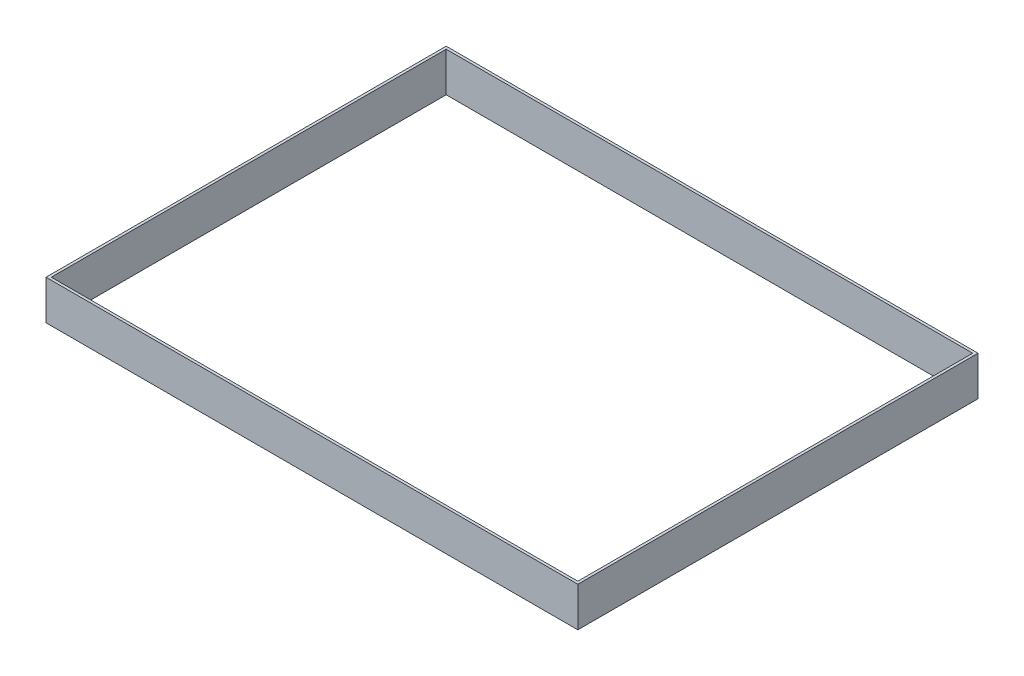
ISO-10303-21;
HEADER;
FILE_DESCRIPTION(('STEP AP214'),'2;1');
FILE_NAME('part.step','',(''),(''),'','','');
FILE_SCHEMA(('AUTOMOTIVE_DESIGN { 1 0 10303 214 1 1 1 1 }'));
ENDSEC;
DATA;
#1=APPLICATION_CONTEXT('core data for automotive mechanical design processes');
#2=APPLICATION_PROTOCOL_DEFINITION('international standard','automotive_design',2000,#1);
#3=PRODUCT_CONTEXT('',#1,'mechanical');
#4=PRODUCT('Part','Part','',(#3));
#5=PRODUCT_RELATED_PRODUCT_CATEGORY('part','',(#4));
#6=PRODUCT_DEFINITION_FORMATION('','',#4);
#7=PRODUCT_DEFINITION_CONTEXT('part definition',#1,'design');
#8=PRODUCT_DEFINITION('design','',#6,#7);
#9=PRODUCT_DEFINITION_SHAPE('','',#8);
#10=(LENGTH_UNIT() NAMED_UNIT(*) SI_UNIT(.MILLI.,.METRE.));
#11=(NAMED_UNIT(*) PLANE_ANGLE_UNIT() SI_UNIT($,.RADIAN.));
#12=(NAMED_UNIT(*) SI_UNIT($,.STERADIAN.) SOLID_ANGLE_UNIT());
#13=UNCERTAINTY_MEASURE_WITH_UNIT(LENGTH_MEASURE(1.E-05),#10,'distance_accuracy_value','');
#14=(GEOMETRIC_REPRESENTATION_CONTEXT(3) GLOBAL_UNCERTAINTY_ASSIGNED_CONTEXT((#13)) GLOBAL_UNIT_ASSIGNED_CONTEXT((#10,
#11,#12)) REPRESENTATION_CONTEXT('',''));
#15=CARTESIAN_POINT('',(0.,0.,0.));
#16=DIRECTION('',(0.,0.,1.));
#17=DIRECTION('',(1.,0.,0.));
#18=AXIS2_PLACEMENT_3D('',#15,#16,#17);
#19=CARTESIAN_POINT('',(0.,3.,0.));
#20=DIRECTION('',(0.,-1.,0.));
#21=DIRECTION('',(0.,0.,-1.));
#22=AXIS2_PLACEMENT_3D('',#19,#20,#21);
#23=PLANE('',#22);
#24=DIRECTION('',(-1.,0.,0.));
#25=VECTOR('',#24,1.);
#26=CARTESIAN_POINT('',(-20.2,3.,-15.2));
#27=LINE('',#26,#25);
#28=CARTESIAN_POINT('',(20.2,3.,-15.2));
#29=VERTEX_POINT('',#28);
#30=CARTESIAN_POINT('',(-20.2,3.,-15.2));
#31=VERTEX_POINT('',#30);
#32=EDGE_CURVE('E136',#29,#31,#27,.T.);
#33=ORIENTED_EDGE('',*,*,#32,.T.);
#34=DIRECTION('',(0.,0.,1.));
#35=VECTOR('',#34,1.);
#36=CARTESIAN_POINT('',(-20.2,3.,-15.2));
#37=LINE('',#36,#35);
#38=CARTESIAN_POINT('',(-20.2,3.,15.2));
#39=VERTEX_POINT('',#38);
#40=EDGE_CURVE('E139',#31,#39,#37,.T.);
#41=ORIENTED_EDGE('',*,*,#40,.T.);
#42=DIRECTION('',(1.,0.,0.));
#43=VECTOR('',#42,1.);
#44=CARTESIAN_POINT('',(-20.2,3.,15.2));
#45=LINE('',#44,#43);
#46=CARTESIAN_POINT('',(20.2,3.,15.2));
#47=VERTEX_POINT('',#46);
#48=EDGE_CURVE('E142',#39,#47,#45,.T.);
#49=ORIENTED_EDGE('',*,*,#48,.T.);
#50=DIRECTION('',(0.,0.,-1.));
#51=VECTOR('',#50,1.);
#52=CARTESIAN_POINT('',(20.2,3.,-15.2));
#53=LINE('',#52,#51);
#54=EDGE_CURVE('E144',#47,#29,#53,.T.);
#55=ORIENTED_EDGE('',*,*,#54,.T.);
#56=EDGE_LOOP('',(#33,#41,#49,#55));
#57=FACE_BOUND('',#56,.T.);
#58=DIRECTION('',(0.,0.,-1.));
#59=VECTOR('',#58,1.);
#60=CARTESIAN_POINT('',(20.,3.,-15.));
#61=LINE('',#60,#59);
#62=CARTESIAN_POINT('',(20.,3.,15.));
#63=VERTEX_POINT('',#62);
#64=CARTESIAN_POINT('',(20.,3.,-15.));
#65=VERTEX_POINT('',#64);
#66=EDGE_CURVE('E100',#63,#65,#61,.T.);
#67=ORIENTED_EDGE('',*,*,#66,.F.);
#68=DIRECTION('',(1.,0.,0.));
#69=VECTOR('',#68,1.);
#70=CARTESIAN_POINT('',(-20.,3.,15.));
#71=LINE('',#70,#69);
#72=CARTESIAN_POINT('',(-20.,3.,15.));
#73=VERTEX_POINT('',#72);
#74=EDGE_CURVE('E122',#73,#63,#71,.T.);
#75=ORIENTED_EDGE('',*,*,#74,.F.);
#76=DIRECTION('',(0.,0.,1.));
#77=VECTOR('',#76,1.);
#78=CARTESIAN_POINT('',(-20.,3.,-15.));
#79=LINE('',#78,#77);
#80=CARTESIAN_POINT('',(-20.,3.,-15.));
#81=VERTEX_POINT('',#80);
#82=EDGE_CURVE('E120',#81,#73,#79,.T.);
#83=ORIENTED_EDGE('',*,*,#82,.F.);
#84=DIRECTION('',(-1.,0.,0.));
#85=VECTOR('',#84,1.);
#86=CARTESIAN_POINT('',(-20.,3.,-15.));
#87=LINE('',#86,#85);
#88=EDGE_CURVE('E108',#65,#81,#87,.T.);
#89=ORIENTED_EDGE('',*,*,#88,.F.);
#90=EDGE_LOOP('',(#67,#75,#83,#89));
#91=FACE_BOUND('',#90,.T.);
#92=ADVANCED_FACE('F35',(#57,#91),#23,.F.);
#93=CARTESIAN_POINT('',(0.,0.,0.));
#94=DIRECTION('',(0.,-1.,0.));
#95=DIRECTION('',(0.,0.,-1.));
#96=AXIS2_PLACEMENT_3D('',#93,#94,#95);
#97=PLANE('',#96);
#98=DIRECTION('',(-1.,0.,0.));
#99=VECTOR('',#98,1.);
#100=CARTESIAN_POINT('',(-20.2,0.,-15.2));
#101=LINE('',#100,#99);
#102=CARTESIAN_POINT('',(20.2,0.,-15.2));
#103=VERTEX_POINT('',#102);
#104=CARTESIAN_POINT('',(-20.2,0.,-15.2));
#105=VERTEX_POINT('',#104);
#106=EDGE_CURVE('E116',#103,#105,#101,.T.);
#107=ORIENTED_EDGE('',*,*,#106,.F.);
#108=DIRECTION('',(0.,0.,-1.));
#109=VECTOR('',#108,1.);
#110=CARTESIAN_POINT('',(20.2,0.,-15.2));
#111=LINE('',#110,#109);
#112=CARTESIAN_POINT('',(20.2,0.,15.2));
#113=VERTEX_POINT('',#112);
#114=EDGE_CURVE('E140',#113,#103,#111,.T.);
#115=ORIENTED_EDGE('',*,*,#114,.F.);
#116=DIRECTION('',(1.,0.,0.));
#117=VECTOR('',#116,1.);
#118=CARTESIAN_POINT('',(-20.2,0.,15.2));
#119=LINE('',#118,#117);
#120=CARTESIAN_POINT('',(-20.2,0.,15.2));
#121=VERTEX_POINT('',#120);
#122=EDGE_CURVE('E151',#121,#113,#119,.T.);
#123=ORIENTED_EDGE('',*,*,#122,.F.);
#124=DIRECTION('',(0.,0.,1.));
#125=VECTOR('',#124,1.);
#126=CARTESIAN_POINT('',(-20.2,0.,-15.2));
#127=LINE('',#126,#125);
#128=EDGE_CURVE('E149',#105,#121,#127,.T.);
#129=ORIENTED_EDGE('',*,*,#128,.F.);
#130=EDGE_LOOP('',(#107,#115,#123,#129));
#131=FACE_BOUND('',#130,.T.);
#132=DIRECTION('',(1.,0.,0.));
#133=VECTOR('',#132,1.);
#134=CARTESIAN_POINT('',(-20.,0.,15.));
#135=LINE('',#134,#133);
#136=CARTESIAN_POINT('',(-20.,0.,15.));
#137=VERTEX_POINT('',#136);
#138=CARTESIAN_POINT('',(20.,0.,15.));
#139=VERTEX_POINT('',#138);
#140=EDGE_CURVE('E109',#137,#139,#135,.T.);
#141=ORIENTED_EDGE('',*,*,#140,.T.);
#142=DIRECTION('',(0.,0.,-1.));
#143=VECTOR('',#142,1.);
#144=CARTESIAN_POINT('',(20.,0.,-15.));
#145=LINE('',#144,#143);
#146=CARTESIAN_POINT('',(20.,0.,-15.));
#147=VERTEX_POINT('',#146);
#148=EDGE_CURVE('E58',#139,#147,#145,.T.);
#149=ORIENTED_EDGE('',*,*,#148,.T.);
#150=DIRECTION('',(-1.,0.,0.));
#151=VECTOR('',#150,1.);
#152=CARTESIAN_POINT('',(-20.,0.,-15.));
#153=LINE('',#152,#151);
#154=CARTESIAN_POINT('',(-20.,0.,-15.));
#155=VERTEX_POINT('',#154);
#156=EDGE_CURVE('E115',#147,#155,#153,.T.);
#157=ORIENTED_EDGE('',*,*,#156,.T.);
#158=DIRECTION('',(0.,0.,1.));
#159=VECTOR('',#158,1.);
#160=CARTESIAN_POINT('',(-20.,0.,-15.));
#161=LINE('',#160,#159);
#162=EDGE_CURVE('E128',#155,#137,#161,.T.);
#163=ORIENTED_EDGE('',*,*,#162,.T.);
#164=EDGE_LOOP('',(#141,#149,#157,#163));
#165=FACE_BOUND('',#164,.T.);
#166=ADVANCED_FACE('F169',(#131,#165),#97,.T.);
#167=CARTESIAN_POINT('',(-20.2,3.,-15.2));
#168=DIRECTION('',(0.,0.,1.));
#169=DIRECTION('',(1.,0.,0.));
#170=AXIS2_PLACEMENT_3D('',#167,#168,#169);
#171=PLANE('',#170);
#172=ORIENTED_EDGE('',*,*,#106,.T.);
#173=DIRECTION('',(0.,-1.,0.));
#174=VECTOR('',#173,1.);
#175=CARTESIAN_POINT('',(-20.2,3.,-15.2));
#176=LINE('',#175,#174);
#177=EDGE_CURVE('E11',#31,#105,#176,.T.);
#178=ORIENTED_EDGE('',*,*,#177,.F.);
#179=ORIENTED_EDGE('',*,*,#32,.F.);
#180=DIRECTION('',(0.,-1.,0.));
#181=VECTOR('',#180,1.);
#182=CARTESIAN_POINT('',(20.2,3.,-15.2));
#183=LINE('',#182,#181);
#184=EDGE_CURVE('E146',#29,#103,#183,.T.);
#185=ORIENTED_EDGE('',*,*,#184,.T.);
#186=EDGE_LOOP('',(#172,#178,#179,#185));
#187=FACE_BOUND('',#186,.T.);
#188=ADVANCED_FACE('F37',(#187),#171,.F.);
#189=CARTESIAN_POINT('',(-20.2,3.,-15.2));
#190=DIRECTION('',(1.,0.,0.));
#191=DIRECTION('',(0.,0.,-1.));
#192=AXIS2_PLACEMENT_3D('',#189,#190,#191);
#193=PLANE('',#192);
#194=ORIENTED_EDGE('',*,*,#128,.T.);
#195=DIRECTION('',(0.,-1.,0.));
#196=VECTOR('',#195,1.);
#197=CARTESIAN_POINT('',(-20.2,3.,15.2));
#198=LINE('',#197,#196);
#199=EDGE_CURVE('E43',#39,#121,#198,.T.);
#200=ORIENTED_EDGE('',*,*,#199,.F.);
#201=ORIENTED_EDGE('',*,*,#40,.F.);
#202=ORIENTED_EDGE('',*,*,#177,.T.);
#203=EDGE_LOOP('',(#194,#200,#201,#202));
#204=FACE_BOUND('',#203,.T.);
#205=ADVANCED_FACE('F179',(#204),#193,.F.);
#206=CARTESIAN_POINT('',(-20.2,3.,15.2));
#207=DIRECTION('',(0.,0.,-1.));
#208=DIRECTION('',(-1.,0.,0.));
#209=AXIS2_PLACEMENT_3D('',#206,#207,#208);
#210=PLANE('',#209);
#211=ORIENTED_EDGE('',*,*,#122,.T.);
#212=DIRECTION('',(0.,-1.,0.));
#213=VECTOR('',#212,1.);
#214=CARTESIAN_POINT('',(20.2,3.,15.2));
#215=LINE('',#214,#213);
#216=EDGE_CURVE('E156',#47,#113,#215,.T.);
#217=ORIENTED_EDGE('',*,*,#216,.F.);
#218=ORIENTED_EDGE('',*,*,#48,.F.);
#219=ORIENTED_EDGE('',*,*,#199,.T.);
#220=EDGE_LOOP('',(#211,#217,#218,#219));
#221=FACE_BOUND('',#220,.T.);
#222=ADVANCED_FACE('F163',(#221),#210,.F.);
#223=CARTESIAN_POINT('',(20.2,3.,-15.2));
#224=DIRECTION('',(-1.,0.,0.));
#225=DIRECTION('',(0.,0.,1.));
#226=AXIS2_PLACEMENT_3D('',#223,#224,#225);
#227=PLANE('',#226);
#228=ORIENTED_EDGE('',*,*,#114,.T.);
#229=ORIENTED_EDGE('',*,*,#184,.F.);
#230=ORIENTED_EDGE('',*,*,#54,.F.);
#231=ORIENTED_EDGE('',*,*,#216,.T.);
#232=EDGE_LOOP('',(#228,#229,#230,#231));
#233=FACE_BOUND('',#232,.T.);
#234=ADVANCED_FACE('F173',(#233),#227,.F.);
#235=CARTESIAN_POINT('',(20.,3.,-15.));
#236=DIRECTION('',(-1.,0.,0.));
#237=DIRECTION('',(0.,0.,1.));
#238=AXIS2_PLACEMENT_3D('',#235,#236,#237);
#239=PLANE('',#238);
#240=ORIENTED_EDGE('',*,*,#148,.F.);
#241=DIRECTION('',(0.,-1.,0.));
#242=VECTOR('',#241,1.);
#243=CARTESIAN_POINT('',(20.,3.,15.));
#244=LINE('',#243,#242);
#245=EDGE_CURVE('E104',#63,#139,#244,.T.);
#246=ORIENTED_EDGE('',*,*,#245,.F.);
#247=ORIENTED_EDGE('',*,*,#66,.T.);
#248=DIRECTION('',(0.,-1.,0.));
#249=VECTOR('',#248,1.);
#250=CARTESIAN_POINT('',(20.,3.,-15.));
#251=LINE('',#250,#249);
#252=EDGE_CURVE('E103',#65,#147,#251,.T.);
#253=ORIENTED_EDGE('',*,*,#252,.T.);
#254=EDGE_LOOP('',(#240,#246,#247,#253));
#255=FACE_BOUND('',#254,.T.);
#256=ADVANCED_FACE('F102',(#255),#239,.T.);
#257=CARTESIAN_POINT('',(-20.,3.,-15.));
#258=DIRECTION('',(0.,0.,1.));
#259=DIRECTION('',(1.,0.,0.));
#260=AXIS2_PLACEMENT_3D('',#257,#258,#259);
#261=PLANE('',#260);
#262=ORIENTED_EDGE('',*,*,#156,.F.);
#263=ORIENTED_EDGE('',*,*,#252,.F.);
#264=ORIENTED_EDGE('',*,*,#88,.T.);
#265=DIRECTION('',(0.,-1.,0.));
#266=VECTOR('',#265,1.);
#267=CARTESIAN_POINT('',(-20.,3.,-15.));
#268=LINE('',#267,#266);
#269=EDGE_CURVE('E117',#81,#155,#268,.T.);
#270=ORIENTED_EDGE('',*,*,#269,.T.);
#271=EDGE_LOOP('',(#262,#263,#264,#270));
#272=FACE_BOUND('',#271,.T.);
#273=ADVANCED_FACE('F112',(#272),#261,.T.);
#274=CARTESIAN_POINT('',(-20.,3.,-15.));
#275=DIRECTION('',(1.,0.,0.));
#276=DIRECTION('',(0.,0.,-1.));
#277=AXIS2_PLACEMENT_3D('',#274,#275,#276);
#278=PLANE('',#277);
#279=ORIENTED_EDGE('',*,*,#162,.F.);
#280=ORIENTED_EDGE('',*,*,#269,.F.);
#281=ORIENTED_EDGE('',*,*,#82,.T.);
#282=DIRECTION('',(0.,-1.,0.));
#283=VECTOR('',#282,1.);
#284=CARTESIAN_POINT('',(-20.,3.,15.));
#285=LINE('',#284,#283);
#286=EDGE_CURVE('E50',#73,#137,#285,.T.);
#287=ORIENTED_EDGE('',*,*,#286,.T.);
#288=EDGE_LOOP('',(#279,#280,#281,#287));
#289=FACE_BOUND('',#288,.T.);
#290=ADVANCED_FACE('F202',(#289),#278,.T.);
#291=CARTESIAN_POINT('',(-20.,3.,15.));
#292=DIRECTION('',(0.,0.,-1.));
#293=DIRECTION('',(-1.,0.,0.));
#294=AXIS2_PLACEMENT_3D('',#291,#292,#293);
#295=PLANE('',#294);
#296=ORIENTED_EDGE('',*,*,#140,.F.);
#297=ORIENTED_EDGE('',*,*,#286,.F.);
#298=ORIENTED_EDGE('',*,*,#74,.T.);
#299=ORIENTED_EDGE('',*,*,#245,.T.);
#300=EDGE_LOOP('',(#296,#297,#298,#299));
#301=FACE_BOUND('',#300,.T.);
#302=ADVANCED_FACE('F206',(#301),#295,.T.);
#303=CLOSED_SHELL('',(#92,#166,#188,#205,#222,#234,#256,#273,#290,#302));
#304=MANIFOLD_SOLID_BREP('B2',#303);
#305=ADVANCED_BREP_SHAPE_REPRESENTATION('',(#18,#304),#14);
#306=SHAPE_DEFINITION_REPRESENTATION(#9,#305);
ENDSEC;
END-ISO-10303-21;
